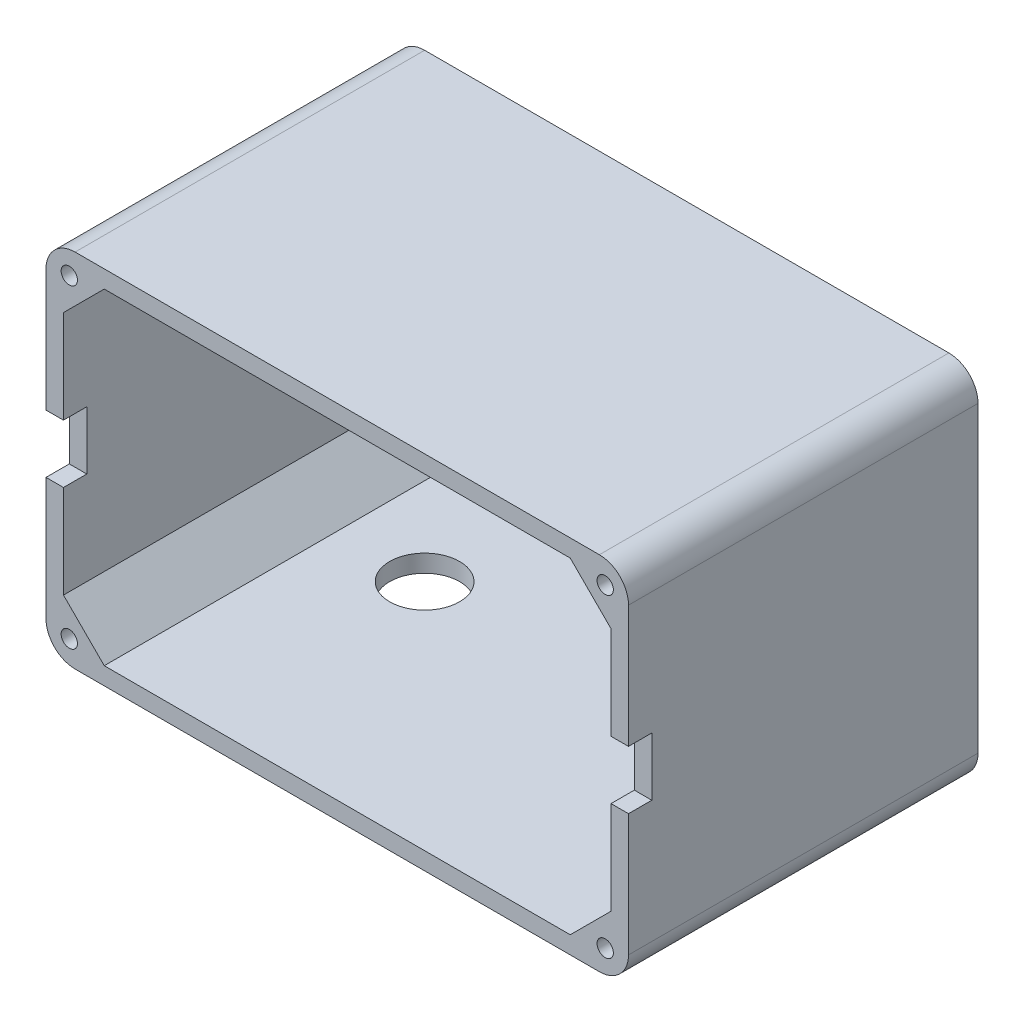
ISO-10303-21;
HEADER;
FILE_DESCRIPTION(('STEP AP214'),'2;1');
FILE_NAME('part.step','',(''),(''),'','','');
FILE_SCHEMA(('AUTOMOTIVE_DESIGN { 1 0 10303 214 1 1 1 1 }'));
ENDSEC;
DATA;
#1=APPLICATION_CONTEXT('core data for automotive mechanical design processes');
#2=APPLICATION_PROTOCOL_DEFINITION('international standard','automotive_design',2000,#1);
#3=PRODUCT_CONTEXT('',#1,'mechanical');
#4=PRODUCT('Part','Part','',(#3));
#5=PRODUCT_RELATED_PRODUCT_CATEGORY('part','',(#4));
#6=PRODUCT_DEFINITION_FORMATION('','',#4);
#7=PRODUCT_DEFINITION_CONTEXT('part definition',#1,'design');
#8=PRODUCT_DEFINITION('design','',#6,#7);
#9=PRODUCT_DEFINITION_SHAPE('','',#8);
#10=(LENGTH_UNIT() NAMED_UNIT(*) SI_UNIT(.MILLI.,.METRE.));
#11=(NAMED_UNIT(*) PLANE_ANGLE_UNIT() SI_UNIT($,.RADIAN.));
#12=(NAMED_UNIT(*) SI_UNIT($,.STERADIAN.) SOLID_ANGLE_UNIT());
#13=UNCERTAINTY_MEASURE_WITH_UNIT(LENGTH_MEASURE(1.E-05),#10,'distance_accuracy_value','');
#14=(GEOMETRIC_REPRESENTATION_CONTEXT(3) GLOBAL_UNCERTAINTY_ASSIGNED_CONTEXT((#13)) GLOBAL_UNIT_ASSIGNED_CONTEXT((#10,
#11,#12)) REPRESENTATION_CONTEXT('',''));
#15=CARTESIAN_POINT('',(0.,0.,0.));
#16=DIRECTION('',(0.,0.,1.));
#17=DIRECTION('',(1.,0.,0.));
#18=AXIS2_PLACEMENT_3D('',#15,#16,#17);
#19=CARTESIAN_POINT('',(-45.,26.,60.));
#20=DIRECTION('',(0.,0.,-1.));
#21=DIRECTION('',(-1.,0.,0.));
#22=AXIS2_PLACEMENT_3D('',#19,#20,#21);
#23=PLANE('',#22);
#24=CARTESIAN_POINT('',(46.,27.,60.));
#25=DIRECTION('',(0.,0.,-1.));
#26=DIRECTION('',(-1.,0.,0.));
#27=AXIS2_PLACEMENT_3D('',#24,#25,#26);
#28=CIRCLE('',#27,1.4);
#29=CARTESIAN_POINT('',(44.6,27.,60.));
#30=VERTEX_POINT('',#29);
#31=EDGE_CURVE('E385',#30,#30,#28,.T.);
#32=ORIENTED_EDGE('',*,*,#31,.T.);
#33=EDGE_LOOP('',(#32));
#34=FACE_BOUND('',#33,.T.);
#35=CARTESIAN_POINT('',(-46.,27.,60.));
#36=DIRECTION('',(0.,0.,1.));
#37=DIRECTION('',(1.,0.,0.));
#38=AXIS2_PLACEMENT_3D('',#35,#36,#37);
#39=CIRCLE('',#38,1.4);
#40=CARTESIAN_POINT('',(-44.6,27.,60.));
#41=VERTEX_POINT('',#40);
#42=EDGE_CURVE('E402',#41,#41,#39,.T.);
#43=ORIENTED_EDGE('',*,*,#42,.F.);
#44=EDGE_LOOP('',(#43));
#45=FACE_BOUND('',#44,.T.);
#46=DIRECTION('',(0.,-1.,0.));
#47=VECTOR('',#46,1.);
#48=CARTESIAN_POINT('',(-50.,26.,60.));
#49=LINE('',#48,#47);
#50=CARTESIAN_POINT('',(-50.,26.,60.));
#51=VERTEX_POINT('',#50);
#52=CARTESIAN_POINT('',(-50.,4.99999999999999,60.));
#53=VERTEX_POINT('',#52);
#54=EDGE_CURVE('E225',#51,#53,#49,.T.);
#55=ORIENTED_EDGE('',*,*,#54,.T.);
#56=DIRECTION('',(1.,0.,0.));
#57=VECTOR('',#56,1.);
#58=CARTESIAN_POINT('',(-50.,4.99999999999999,60.));
#59=LINE('',#58,#57);
#60=CARTESIAN_POINT('',(-47.,4.99999999999999,60.));
#61=VERTEX_POINT('',#60);
#62=EDGE_CURVE('E318',#53,#61,#59,.T.);
#63=ORIENTED_EDGE('',*,*,#62,.T.);
#64=DIRECTION('',(0.,-1.,0.));
#65=VECTOR('',#64,1.);
#66=CARTESIAN_POINT('',(-47.,23.,60.));
#67=LINE('',#66,#65);
#68=CARTESIAN_POINT('',(-47.,21.,60.));
#69=VERTEX_POINT('',#68);
#70=EDGE_CURVE('E422',#69,#61,#67,.T.);
#71=ORIENTED_EDGE('',*,*,#70,.F.);
#72=DIRECTION('',(0.707106781186547,0.707106781186547,0.));
#73=VECTOR('',#72,1.);
#74=CARTESIAN_POINT('',(-47.,21.,60.));
#75=LINE('',#74,#73);
#76=CARTESIAN_POINT('',(-40.,28.,60.));
#77=VERTEX_POINT('',#76);
#78=EDGE_CURVE('E408',#69,#77,#75,.T.);
#79=ORIENTED_EDGE('',*,*,#78,.T.);
#80=DIRECTION('',(-1.,0.,0.));
#81=VECTOR('',#80,1.);
#82=CARTESIAN_POINT('',(-42.,28.,60.));
#83=LINE('',#82,#81);
#84=CARTESIAN_POINT('',(40.,28.,60.));
#85=VERTEX_POINT('',#84);
#86=EDGE_CURVE('E252',#85,#77,#83,.T.);
#87=ORIENTED_EDGE('',*,*,#86,.F.);
#88=DIRECTION('',(-0.707106781186547,0.707106781186547,0.));
#89=VECTOR('',#88,1.);
#90=CARTESIAN_POINT('',(47.,21.,60.));
#91=LINE('',#90,#89);
#92=CARTESIAN_POINT('',(47.,21.,60.));
#93=VERTEX_POINT('',#92);
#94=EDGE_CURVE('E390',#93,#85,#91,.T.);
#95=ORIENTED_EDGE('',*,*,#94,.F.);
#96=DIRECTION('',(0.,1.,0.));
#97=VECTOR('',#96,1.);
#98=CARTESIAN_POINT('',(47.,23.,60.));
#99=LINE('',#98,#97);
#100=CARTESIAN_POINT('',(47.,5.,60.));
#101=VERTEX_POINT('',#100);
#102=EDGE_CURVE('E427',#101,#93,#99,.T.);
#103=ORIENTED_EDGE('',*,*,#102,.F.);
#104=CARTESIAN_POINT('',(50.,5.,60.));
#105=VERTEX_POINT('',#104);
#106=EDGE_CURVE('E322',#101,#105,#59,.T.);
#107=ORIENTED_EDGE('',*,*,#106,.T.);
#108=DIRECTION('',(0.,1.,0.));
#109=VECTOR('',#108,1.);
#110=CARTESIAN_POINT('',(50.,26.,60.));
#111=LINE('',#110,#109);
#112=CARTESIAN_POINT('',(50.,26.,60.));
#113=VERTEX_POINT('',#112);
#114=EDGE_CURVE('E240',#105,#113,#111,.T.);
#115=ORIENTED_EDGE('',*,*,#114,.T.);
#116=CARTESIAN_POINT('',(45.,26.,60.));
#117=DIRECTION('',(0.,0.,1.));
#118=DIRECTION('',(1.,0.,0.));
#119=AXIS2_PLACEMENT_3D('',#116,#117,#118);
#120=CIRCLE('',#119,5.);
#121=CARTESIAN_POINT('',(45.,31.,60.));
#122=VERTEX_POINT('',#121);
#123=EDGE_CURVE('E243',#113,#122,#120,.T.);
#124=ORIENTED_EDGE('',*,*,#123,.T.);
#125=DIRECTION('',(-1.,0.,0.));
#126=VECTOR('',#125,1.);
#127=CARTESIAN_POINT('',(-45.,31.,60.));
#128=LINE('',#127,#126);
#129=CARTESIAN_POINT('',(-45.,31.,60.));
#130=VERTEX_POINT('',#129);
#131=EDGE_CURVE('E245',#122,#130,#128,.T.);
#132=ORIENTED_EDGE('',*,*,#131,.T.);
#133=CARTESIAN_POINT('',(-45.,26.,60.));
#134=DIRECTION('',(0.,0.,1.));
#135=DIRECTION('',(-1.,0.,0.));
#136=AXIS2_PLACEMENT_3D('',#133,#134,#135);
#137=CIRCLE('',#136,5.);
#138=EDGE_CURVE('E226',#130,#51,#137,.T.);
#139=ORIENTED_EDGE('',*,*,#138,.T.);
#140=EDGE_LOOP('',(#55,#63,#71,#79,#87,#95,#103,#107,#115,#124,#132,#139));
#141=FACE_BOUND('',#140,.T.);
#142=ADVANCED_FACE('F39',(#34,#45,#141),#23,.F.);
#143=CARTESIAN_POINT('',(-47.,23.,60.));
#144=DIRECTION('',(1.,0.,0.));
#145=DIRECTION('',(0.,1.,0.));
#146=AXIS2_PLACEMENT_3D('',#143,#144,#145);
#147=PLANE('',#146);
#148=DIRECTION('',(0.,0.,1.));
#149=VECTOR('',#148,1.);
#150=CARTESIAN_POINT('',(-47.,4.99999999999999,60.));
#151=LINE('',#150,#149);
#152=CARTESIAN_POINT('',(-47.,4.99999999999999,56.));
#153=VERTEX_POINT('',#152);
#154=EDGE_CURVE('E337',#153,#61,#151,.T.);
#155=ORIENTED_EDGE('',*,*,#154,.F.);
#156=DIRECTION('',(0.,1.,0.));
#157=VECTOR('',#156,1.);
#158=CARTESIAN_POINT('',(-47.,23.,56.));
#159=LINE('',#158,#157);
#160=CARTESIAN_POINT('',(-47.,-5.00000000000001,56.));
#161=VERTEX_POINT('',#160);
#162=EDGE_CURVE('E333',#161,#153,#159,.T.);
#163=ORIENTED_EDGE('',*,*,#162,.F.);
#164=DIRECTION('',(0.,0.,-1.));
#165=VECTOR('',#164,1.);
#166=CARTESIAN_POINT('',(-47.,-5.00000000000002,60.));
#167=LINE('',#166,#165);
#168=CARTESIAN_POINT('',(-47.,-5.00000000000001,60.));
#169=VERTEX_POINT('',#168);
#170=EDGE_CURVE('E329',#169,#161,#167,.T.);
#171=ORIENTED_EDGE('',*,*,#170,.F.);
#172=CARTESIAN_POINT('',(-47.,-21.,60.));
#173=VERTEX_POINT('',#172);
#174=EDGE_CURVE('E219',#169,#173,#67,.T.);
#175=ORIENTED_EDGE('',*,*,#174,.T.);
#176=DIRECTION('',(0.,0.,1.));
#177=VECTOR('',#176,1.);
#178=CARTESIAN_POINT('',(-47.,-21.,0.));
#179=LINE('',#178,#177);
#180=CARTESIAN_POINT('',(-47.,-21.,0.));
#181=VERTEX_POINT('',#180);
#182=EDGE_CURVE('E364',#181,#173,#179,.T.);
#183=ORIENTED_EDGE('',*,*,#182,.F.);
#184=DIRECTION('',(0.,-1.,0.));
#185=VECTOR('',#184,1.);
#186=CARTESIAN_POINT('',(-47.,23.,0.));
#187=LINE('',#186,#185);
#188=CARTESIAN_POINT('',(-47.,21.,0.));
#189=VERTEX_POINT('',#188);
#190=EDGE_CURVE('E420',#189,#181,#187,.T.);
#191=ORIENTED_EDGE('',*,*,#190,.F.);
#192=DIRECTION('',(0.,0.,1.));
#193=VECTOR('',#192,1.);
#194=CARTESIAN_POINT('',(-47.,21.,0.));
#195=LINE('',#194,#193);
#196=EDGE_CURVE('E414',#189,#69,#195,.T.);
#197=ORIENTED_EDGE('',*,*,#196,.T.);
#198=ORIENTED_EDGE('',*,*,#70,.T.);
#199=EDGE_LOOP('',(#155,#163,#171,#175,#183,#191,#197,#198));
#200=FACE_BOUND('',#199,.T.);
#201=ADVANCED_FACE('F442',(#200),#147,.T.);
#202=CARTESIAN_POINT('',(-42.,-28.,60.));
#203=DIRECTION('',(0.,1.,0.));
#204=DIRECTION('',(0.,0.,1.));
#205=AXIS2_PLACEMENT_3D('',#202,#203,#204);
#206=PLANE('',#205);
#207=CARTESIAN_POINT('',(-25.,-28.,20.));
#208=DIRECTION('',(0.,1.,0.));
#209=DIRECTION('',(0.,0.,1.));
#210=AXIS2_PLACEMENT_3D('',#207,#208,#209);
#211=CIRCLE('',#210,6.);
#212=CARTESIAN_POINT('',(-25.,-28.,26.));
#213=VERTEX_POINT('',#212);
#214=EDGE_CURVE('E348',#213,#213,#211,.T.);
#215=ORIENTED_EDGE('',*,*,#214,.F.);
#216=EDGE_LOOP('',(#215));
#217=FACE_BOUND('',#216,.T.);
#218=CARTESIAN_POINT('',(25.,-28.,20.));
#219=DIRECTION('',(0.,1.,0.));
#220=DIRECTION('',(0.,0.,1.));
#221=AXIS2_PLACEMENT_3D('',#218,#219,#220);
#222=CIRCLE('',#221,6.);
#223=CARTESIAN_POINT('',(25.,-28.,26.));
#224=VERTEX_POINT('',#223);
#225=EDGE_CURVE('E343',#224,#224,#222,.T.);
#226=ORIENTED_EDGE('',*,*,#225,.F.);
#227=EDGE_LOOP('',(#226));
#228=FACE_BOUND('',#227,.T.);
#229=DIRECTION('',(1.,0.,0.));
#230=VECTOR('',#229,1.);
#231=CARTESIAN_POINT('',(-42.,-28.,0.));
#232=LINE('',#231,#230);
#233=CARTESIAN_POINT('',(-40.,-28.,0.));
#234=VERTEX_POINT('',#233);
#235=CARTESIAN_POINT('',(40.,-28.,0.));
#236=VERTEX_POINT('',#235);
#237=EDGE_CURVE('E433',#234,#236,#232,.T.);
#238=ORIENTED_EDGE('',*,*,#237,.F.);
#239=DIRECTION('',(0.,0.,1.));
#240=VECTOR('',#239,1.);
#241=CARTESIAN_POINT('',(-40.,-28.,0.));
#242=LINE('',#241,#240);
#243=CARTESIAN_POINT('',(-40.,-28.,60.));
#244=VERTEX_POINT('',#243);
#245=EDGE_CURVE('E361',#234,#244,#242,.T.);
#246=ORIENTED_EDGE('',*,*,#245,.T.);
#247=DIRECTION('',(1.,0.,0.));
#248=VECTOR('',#247,1.);
#249=CARTESIAN_POINT('',(-42.,-28.,60.));
#250=LINE('',#249,#248);
#251=CARTESIAN_POINT('',(40.,-28.,60.));
#252=VERTEX_POINT('',#251);
#253=EDGE_CURVE('E425',#244,#252,#250,.T.);
#254=ORIENTED_EDGE('',*,*,#253,.T.);
#255=DIRECTION('',(0.,0.,1.));
#256=VECTOR('',#255,1.);
#257=CARTESIAN_POINT('',(40.,-28.,0.));
#258=LINE('',#257,#256);
#259=EDGE_CURVE('E382',#236,#252,#258,.T.);
#260=ORIENTED_EDGE('',*,*,#259,.F.);
#261=EDGE_LOOP('',(#238,#246,#254,#260));
#262=FACE_BOUND('',#261,.T.);
#263=ADVANCED_FACE('F451',(#217,#228,#262),#206,.T.);
#264=CARTESIAN_POINT('',(47.,23.,60.));
#265=DIRECTION('',(-1.,0.,0.));
#266=DIRECTION('',(0.,0.,1.));
#267=AXIS2_PLACEMENT_3D('',#264,#265,#266);
#268=PLANE('',#267);
#269=DIRECTION('',(0.,0.,-1.));
#270=VECTOR('',#269,1.);
#271=CARTESIAN_POINT('',(47.,5.,60.));
#272=LINE('',#271,#270);
#273=CARTESIAN_POINT('',(47.,5.,56.));
#274=VERTEX_POINT('',#273);
#275=EDGE_CURVE('E335',#101,#274,#272,.T.);
#276=ORIENTED_EDGE('',*,*,#275,.F.);
#277=ORIENTED_EDGE('',*,*,#102,.T.);
#278=DIRECTION('',(0.,0.,1.));
#279=VECTOR('',#278,1.);
#280=CARTESIAN_POINT('',(47.,21.,0.));
#281=LINE('',#280,#279);
#282=CARTESIAN_POINT('',(47.,21.,0.));
#283=VERTEX_POINT('',#282);
#284=EDGE_CURVE('E399',#283,#93,#281,.T.);
#285=ORIENTED_EDGE('',*,*,#284,.F.);
#286=DIRECTION('',(0.,1.,0.));
#287=VECTOR('',#286,1.);
#288=CARTESIAN_POINT('',(47.,23.,0.));
#289=LINE('',#288,#287);
#290=CARTESIAN_POINT('',(47.,-21.,0.));
#291=VERTEX_POINT('',#290);
#292=EDGE_CURVE('E435',#291,#283,#289,.T.);
#293=ORIENTED_EDGE('',*,*,#292,.F.);
#294=DIRECTION('',(0.,0.,1.));
#295=VECTOR('',#294,1.);
#296=CARTESIAN_POINT('',(47.,-21.,0.));
#297=LINE('',#296,#295);
#298=CARTESIAN_POINT('',(47.,-21.,60.));
#299=VERTEX_POINT('',#298);
#300=EDGE_CURVE('E379',#291,#299,#297,.T.);
#301=ORIENTED_EDGE('',*,*,#300,.T.);
#302=CARTESIAN_POINT('',(47.,-5.,60.));
#303=VERTEX_POINT('',#302);
#304=EDGE_CURVE('E428',#299,#303,#99,.T.);
#305=ORIENTED_EDGE('',*,*,#304,.T.);
#306=DIRECTION('',(0.,0.,1.));
#307=VECTOR('',#306,1.);
#308=CARTESIAN_POINT('',(47.,-5.,60.));
#309=LINE('',#308,#307);
#310=CARTESIAN_POINT('',(47.,-5.,56.));
#311=VERTEX_POINT('',#310);
#312=EDGE_CURVE('E321',#311,#303,#309,.T.);
#313=ORIENTED_EDGE('',*,*,#312,.F.);
#314=DIRECTION('',(0.,-1.,0.));
#315=VECTOR('',#314,1.);
#316=CARTESIAN_POINT('',(47.,23.,56.));
#317=LINE('',#316,#315);
#318=EDGE_CURVE('E331',#274,#311,#317,.T.);
#319=ORIENTED_EDGE('',*,*,#318,.F.);
#320=EDGE_LOOP('',(#276,#277,#285,#293,#301,#305,#313,#319));
#321=FACE_BOUND('',#320,.T.);
#322=ADVANCED_FACE('F497',(#321),#268,.T.);
#323=CARTESIAN_POINT('',(-42.,28.,60.));
#324=DIRECTION('',(0.,-1.,0.));
#325=DIRECTION('',(0.,0.,-1.));
#326=AXIS2_PLACEMENT_3D('',#323,#324,#325);
#327=PLANE('',#326);
#328=DIRECTION('',(-1.,0.,0.));
#329=VECTOR('',#328,1.);
#330=CARTESIAN_POINT('',(-42.,28.,0.));
#331=LINE('',#330,#329);
#332=CARTESIAN_POINT('',(40.,28.,0.));
#333=VERTEX_POINT('',#332);
#334=CARTESIAN_POINT('',(-40.,28.,0.));
#335=VERTEX_POINT('',#334);
#336=EDGE_CURVE('E436',#333,#335,#331,.T.);
#337=ORIENTED_EDGE('',*,*,#336,.F.);
#338=DIRECTION('',(0.,0.,1.));
#339=VECTOR('',#338,1.);
#340=CARTESIAN_POINT('',(40.,28.,0.));
#341=LINE('',#340,#339);
#342=EDGE_CURVE('E396',#333,#85,#341,.T.);
#343=ORIENTED_EDGE('',*,*,#342,.T.);
#344=ORIENTED_EDGE('',*,*,#86,.T.);
#345=DIRECTION('',(0.,0.,1.));
#346=VECTOR('',#345,1.);
#347=CARTESIAN_POINT('',(-40.,28.,0.));
#348=LINE('',#347,#346);
#349=EDGE_CURVE('E417',#335,#77,#348,.T.);
#350=ORIENTED_EDGE('',*,*,#349,.F.);
#351=EDGE_LOOP('',(#337,#343,#344,#350));
#352=FACE_BOUND('',#351,.T.);
#353=ADVANCED_FACE('F490',(#352),#327,.T.);
#354=CARTESIAN_POINT('',(-46.,-27.,60.));
#355=DIRECTION('',(0.,0.,-1.));
#356=DIRECTION('',(1.,0.,0.));
#357=AXIS2_PLACEMENT_3D('',#354,#355,#356);
#358=CIRCLE('',#357,1.4);
#359=CARTESIAN_POINT('',(-44.6,-27.,60.));
#360=VERTEX_POINT('',#359);
#361=EDGE_CURVE('E351',#360,#360,#358,.T.);
#362=ORIENTED_EDGE('',*,*,#361,.T.);
#363=EDGE_LOOP('',(#362));
#364=FACE_BOUND('',#363,.T.);
#365=CARTESIAN_POINT('',(50.,-26.,60.));
#366=VERTEX_POINT('',#365);
#367=CARTESIAN_POINT('',(50.,-5.,60.));
#368=VERTEX_POINT('',#367);
#369=EDGE_CURVE('E241',#366,#368,#111,.T.);
#370=ORIENTED_EDGE('',*,*,#369,.T.);
#371=DIRECTION('',(1.,0.,0.));
#372=VECTOR('',#371,1.);
#373=CARTESIAN_POINT('',(-50.,-5.00000000000001,60.));
#374=LINE('',#373,#372);
#375=EDGE_CURVE('E62',#303,#368,#374,.T.);
#376=ORIENTED_EDGE('',*,*,#375,.F.);
#377=ORIENTED_EDGE('',*,*,#304,.F.);
#378=DIRECTION('',(-0.707106781186547,-0.707106781186547,0.));
#379=VECTOR('',#378,1.);
#380=CARTESIAN_POINT('',(47.,-21.,60.));
#381=LINE('',#380,#379);
#382=EDGE_CURVE('E373',#299,#252,#381,.T.);
#383=ORIENTED_EDGE('',*,*,#382,.T.);
#384=ORIENTED_EDGE('',*,*,#253,.F.);
#385=DIRECTION('',(0.707106781186547,-0.707106781186547,0.));
#386=VECTOR('',#385,1.);
#387=CARTESIAN_POINT('',(-47.,-21.,60.));
#388=LINE('',#387,#386);
#389=EDGE_CURVE('E355',#173,#244,#388,.T.);
#390=ORIENTED_EDGE('',*,*,#389,.F.);
#391=ORIENTED_EDGE('',*,*,#174,.F.);
#392=CARTESIAN_POINT('',(-50.,-5.00000000000001,60.));
#393=VERTEX_POINT('',#392);
#394=EDGE_CURVE('E204',#393,#169,#374,.T.);
#395=ORIENTED_EDGE('',*,*,#394,.F.);
#396=CARTESIAN_POINT('',(-50.,-26.,60.));
#397=VERTEX_POINT('',#396);
#398=EDGE_CURVE('E216',#393,#397,#49,.T.);
#399=ORIENTED_EDGE('',*,*,#398,.T.);
#400=CARTESIAN_POINT('',(-45.,-26.,60.));
#401=DIRECTION('',(0.,0.,1.));
#402=DIRECTION('',(-1.,0.,0.));
#403=AXIS2_PLACEMENT_3D('',#400,#401,#402);
#404=CIRCLE('',#403,5.);
#405=CARTESIAN_POINT('',(-45.,-31.,60.));
#406=VERTEX_POINT('',#405);
#407=EDGE_CURVE('E229',#397,#406,#404,.T.);
#408=ORIENTED_EDGE('',*,*,#407,.T.);
#409=DIRECTION('',(1.,0.,0.));
#410=VECTOR('',#409,1.);
#411=CARTESIAN_POINT('',(-45.,-31.,60.));
#412=LINE('',#411,#410);
#413=CARTESIAN_POINT('',(45.,-31.,60.));
#414=VERTEX_POINT('',#413);
#415=EDGE_CURVE('E236',#406,#414,#412,.T.);
#416=ORIENTED_EDGE('',*,*,#415,.T.);
#417=CARTESIAN_POINT('',(45.,-26.,60.));
#418=DIRECTION('',(0.,0.,1.));
#419=DIRECTION('',(1.,0.,0.));
#420=AXIS2_PLACEMENT_3D('',#417,#418,#419);
#421=CIRCLE('',#420,5.);
#422=EDGE_CURVE('E238',#414,#366,#421,.T.);
#423=ORIENTED_EDGE('',*,*,#422,.T.);
#424=EDGE_LOOP('',(#370,#376,#377,#383,#384,#390,#391,#395,#399,#408,#416,#423));
#425=FACE_BOUND('',#424,.T.);
#426=CARTESIAN_POINT('',(46.,-27.,60.));
#427=DIRECTION('',(0.,0.,1.));
#428=DIRECTION('',(-1.,0.,0.));
#429=AXIS2_PLACEMENT_3D('',#426,#427,#428);
#430=CIRCLE('',#429,1.4);
#431=CARTESIAN_POINT('',(44.6,-27.,60.));
#432=VERTEX_POINT('',#431);
#433=EDGE_CURVE('E367',#432,#432,#430,.T.);
#434=ORIENTED_EDGE('',*,*,#433,.F.);
#435=EDGE_LOOP('',(#434));
#436=FACE_BOUND('',#435,.T.);
#437=ADVANCED_FACE('F214',(#364,#425,#436),#23,.F.);
#438=CARTESIAN_POINT('',(-45.,26.,0.));
#439=DIRECTION('',(0.,0.,-1.));
#440=DIRECTION('',(-1.,0.,0.));
#441=AXIS2_PLACEMENT_3D('',#438,#439,#440);
#442=PLANE('',#441);
#443=CARTESIAN_POINT('',(-46.,-27.,0.));
#444=DIRECTION('',(0.,0.,-1.));
#445=DIRECTION('',(1.,0.,0.));
#446=AXIS2_PLACEMENT_3D('',#443,#444,#445);
#447=CIRCLE('',#446,1.4);
#448=CARTESIAN_POINT('',(-44.6,-27.,0.));
#449=VERTEX_POINT('',#448);
#450=EDGE_CURVE('E352',#449,#449,#447,.T.);
#451=ORIENTED_EDGE('',*,*,#450,.F.);
#452=EDGE_LOOP('',(#451));
#453=FACE_BOUND('',#452,.T.);
#454=ORIENTED_EDGE('',*,*,#190,.T.);
#455=DIRECTION('',(0.707106781186547,-0.707106781186547,0.));
#456=VECTOR('',#455,1.);
#457=CARTESIAN_POINT('',(-47.,-21.,0.));
#458=LINE('',#457,#456);
#459=EDGE_CURVE('E358',#181,#234,#458,.T.);
#460=ORIENTED_EDGE('',*,*,#459,.T.);
#461=ORIENTED_EDGE('',*,*,#237,.T.);
#462=DIRECTION('',(-0.707106781186547,-0.707106781186547,0.));
#463=VECTOR('',#462,1.);
#464=CARTESIAN_POINT('',(47.,-21.,0.));
#465=LINE('',#464,#463);
#466=EDGE_CURVE('E376',#291,#236,#465,.T.);
#467=ORIENTED_EDGE('',*,*,#466,.F.);
#468=ORIENTED_EDGE('',*,*,#292,.T.);
#469=DIRECTION('',(-0.707106781186547,0.707106781186547,0.));
#470=VECTOR('',#469,1.);
#471=CARTESIAN_POINT('',(47.,21.,0.));
#472=LINE('',#471,#470);
#473=EDGE_CURVE('E393',#283,#333,#472,.T.);
#474=ORIENTED_EDGE('',*,*,#473,.T.);
#475=ORIENTED_EDGE('',*,*,#336,.T.);
#476=DIRECTION('',(0.707106781186547,0.707106781186547,0.));
#477=VECTOR('',#476,1.);
#478=CARTESIAN_POINT('',(-47.,21.,0.));
#479=LINE('',#478,#477);
#480=EDGE_CURVE('E411',#189,#335,#479,.T.);
#481=ORIENTED_EDGE('',*,*,#480,.F.);
#482=EDGE_LOOP('',(#454,#460,#461,#467,#468,#474,#475,#481));
#483=FACE_BOUND('',#482,.T.);
#484=CARTESIAN_POINT('',(46.,-27.,0.));
#485=DIRECTION('',(0.,0.,1.));
#486=DIRECTION('',(-1.,0.,0.));
#487=AXIS2_PLACEMENT_3D('',#484,#485,#486);
#488=CIRCLE('',#487,1.4);
#489=CARTESIAN_POINT('',(44.6,-27.,0.));
#490=VERTEX_POINT('',#489);
#491=EDGE_CURVE('E370',#490,#490,#488,.T.);
#492=ORIENTED_EDGE('',*,*,#491,.T.);
#493=EDGE_LOOP('',(#492));
#494=FACE_BOUND('',#493,.T.);
#495=CARTESIAN_POINT('',(46.,27.,0.));
#496=DIRECTION('',(0.,0.,-1.));
#497=DIRECTION('',(-1.,0.,0.));
#498=AXIS2_PLACEMENT_3D('',#495,#496,#497);
#499=CIRCLE('',#498,1.4);
#500=CARTESIAN_POINT('',(44.6,27.,0.));
#501=VERTEX_POINT('',#500);
#502=EDGE_CURVE('E387',#501,#501,#499,.T.);
#503=ORIENTED_EDGE('',*,*,#502,.F.);
#504=EDGE_LOOP('',(#503));
#505=FACE_BOUND('',#504,.T.);
#506=CARTESIAN_POINT('',(-46.,27.,0.));
#507=DIRECTION('',(0.,0.,1.));
#508=DIRECTION('',(1.,0.,0.));
#509=AXIS2_PLACEMENT_3D('',#506,#507,#508);
#510=CIRCLE('',#509,1.4);
#511=CARTESIAN_POINT('',(-44.6,27.,0.));
#512=VERTEX_POINT('',#511);
#513=EDGE_CURVE('E405',#512,#512,#510,.T.);
#514=ORIENTED_EDGE('',*,*,#513,.T.);
#515=EDGE_LOOP('',(#514));
#516=FACE_BOUND('',#515,.T.);
#517=CARTESIAN_POINT('',(-45.,26.,0.));
#518=DIRECTION('',(0.,0.,1.));
#519=DIRECTION('',(-1.,0.,0.));
#520=AXIS2_PLACEMENT_3D('',#517,#518,#519);
#521=CIRCLE('',#520,5.);
#522=CARTESIAN_POINT('',(-45.,31.,0.));
#523=VERTEX_POINT('',#522);
#524=CARTESIAN_POINT('',(-50.,26.,0.));
#525=VERTEX_POINT('',#524);
#526=EDGE_CURVE('E248',#523,#525,#521,.T.);
#527=ORIENTED_EDGE('',*,*,#526,.F.);
#528=DIRECTION('',(-1.,0.,0.));
#529=VECTOR('',#528,1.);
#530=CARTESIAN_POINT('',(-45.,31.,0.));
#531=LINE('',#530,#529);
#532=CARTESIAN_POINT('',(45.,31.,0.));
#533=VERTEX_POINT('',#532);
#534=EDGE_CURVE('E231',#533,#523,#531,.T.);
#535=ORIENTED_EDGE('',*,*,#534,.F.);
#536=CARTESIAN_POINT('',(45.,26.,0.));
#537=DIRECTION('',(0.,0.,1.));
#538=DIRECTION('',(1.,0.,0.));
#539=AXIS2_PLACEMENT_3D('',#536,#537,#538);
#540=CIRCLE('',#539,5.);
#541=CARTESIAN_POINT('',(50.,26.,0.));
#542=VERTEX_POINT('',#541);
#543=EDGE_CURVE('E262',#542,#533,#540,.T.);
#544=ORIENTED_EDGE('',*,*,#543,.F.);
#545=DIRECTION('',(0.,1.,0.));
#546=VECTOR('',#545,1.);
#547=CARTESIAN_POINT('',(50.,26.,0.));
#548=LINE('',#547,#546);
#549=CARTESIAN_POINT('',(50.,-26.,0.));
#550=VERTEX_POINT('',#549);
#551=EDGE_CURVE('E260',#550,#542,#548,.T.);
#552=ORIENTED_EDGE('',*,*,#551,.F.);
#553=CARTESIAN_POINT('',(45.,-26.,0.));
#554=DIRECTION('',(0.,0.,1.));
#555=DIRECTION('',(1.,0.,0.));
#556=AXIS2_PLACEMENT_3D('',#553,#554,#555);
#557=CIRCLE('',#556,5.);
#558=CARTESIAN_POINT('',(45.,-31.,0.));
#559=VERTEX_POINT('',#558);
#560=EDGE_CURVE('E258',#559,#550,#557,.T.);
#561=ORIENTED_EDGE('',*,*,#560,.F.);
#562=DIRECTION('',(1.,0.,0.));
#563=VECTOR('',#562,1.);
#564=CARTESIAN_POINT('',(-45.,-31.,0.));
#565=LINE('',#564,#563);
#566=CARTESIAN_POINT('',(-45.,-31.,0.));
#567=VERTEX_POINT('',#566);
#568=EDGE_CURVE('E256',#567,#559,#565,.T.);
#569=ORIENTED_EDGE('',*,*,#568,.F.);
#570=CARTESIAN_POINT('',(-45.,-26.,0.));
#571=DIRECTION('',(0.,0.,1.));
#572=DIRECTION('',(-1.,0.,0.));
#573=AXIS2_PLACEMENT_3D('',#570,#571,#572);
#574=CIRCLE('',#573,5.);
#575=CARTESIAN_POINT('',(-50.,-26.,0.));
#576=VERTEX_POINT('',#575);
#577=EDGE_CURVE('E254',#576,#567,#574,.T.);
#578=ORIENTED_EDGE('',*,*,#577,.F.);
#579=DIRECTION('',(0.,-1.,0.));
#580=VECTOR('',#579,1.);
#581=CARTESIAN_POINT('',(-50.,26.,0.));
#582=LINE('',#581,#580);
#583=EDGE_CURVE('E251',#525,#576,#582,.T.);
#584=ORIENTED_EDGE('',*,*,#583,.F.);
#585=EDGE_LOOP('',(#527,#535,#544,#552,#561,#569,#578,#584));
#586=FACE_BOUND('',#585,.T.);
#587=ADVANCED_FACE('F288',(#453,#483,#494,#505,#516,#586),#442,.T.);
#588=CARTESIAN_POINT('',(-45.,26.,60.));
#589=DIRECTION('',(0.,0.,-1.));
#590=DIRECTION('',(-1.,0.,0.));
#591=AXIS2_PLACEMENT_3D('',#588,#589,#590);
#592=CYLINDRICAL_SURFACE('',#591,5.);
#593=ORIENTED_EDGE('',*,*,#526,.T.);
#594=DIRECTION('',(0.,0.,-1.));
#595=VECTOR('',#594,1.);
#596=CARTESIAN_POINT('',(-50.,26.,60.));
#597=LINE('',#596,#595);
#598=EDGE_CURVE('E11',#51,#525,#597,.T.);
#599=ORIENTED_EDGE('',*,*,#598,.F.);
#600=ORIENTED_EDGE('',*,*,#138,.F.);
#601=DIRECTION('',(0.,0.,-1.));
#602=VECTOR('',#601,1.);
#603=CARTESIAN_POINT('',(-45.,31.,60.));
#604=LINE('',#603,#602);
#605=EDGE_CURVE('E247',#130,#523,#604,.T.);
#606=ORIENTED_EDGE('',*,*,#605,.T.);
#607=EDGE_LOOP('',(#593,#599,#600,#606));
#608=FACE_BOUND('',#607,.T.);
#609=ADVANCED_FACE('F41',(#608),#592,.T.);
#610=CARTESIAN_POINT('',(-50.,26.,60.));
#611=DIRECTION('',(1.,0.,0.));
#612=DIRECTION('',(0.,1.,0.));
#613=AXIS2_PLACEMENT_3D('',#610,#611,#612);
#614=PLANE('',#613);
#615=DIRECTION('',(0.,1.,0.));
#616=VECTOR('',#615,1.);
#617=CARTESIAN_POINT('',(-50.,4.99999999999999,56.));
#618=LINE('',#617,#616);
#619=CARTESIAN_POINT('',(-50.,-5.00000000000002,56.));
#620=VERTEX_POINT('',#619);
#621=CARTESIAN_POINT('',(-50.,4.99999999999999,56.));
#622=VERTEX_POINT('',#621);
#623=EDGE_CURVE('E54',#620,#622,#618,.T.);
#624=ORIENTED_EDGE('',*,*,#623,.T.);
#625=DIRECTION('',(0.,0.,1.));
#626=VECTOR('',#625,1.);
#627=CARTESIAN_POINT('',(-50.,4.99999999999999,60.));
#628=LINE('',#627,#626);
#629=EDGE_CURVE('E314',#622,#53,#628,.T.);
#630=ORIENTED_EDGE('',*,*,#629,.T.);
#631=ORIENTED_EDGE('',*,*,#54,.F.);
#632=ORIENTED_EDGE('',*,*,#598,.T.);
#633=ORIENTED_EDGE('',*,*,#583,.T.);
#634=DIRECTION('',(0.,0.,-1.));
#635=VECTOR('',#634,1.);
#636=CARTESIAN_POINT('',(-50.,-26.,60.));
#637=LINE('',#636,#635);
#638=EDGE_CURVE('E47',#397,#576,#637,.T.);
#639=ORIENTED_EDGE('',*,*,#638,.F.);
#640=ORIENTED_EDGE('',*,*,#398,.F.);
#641=DIRECTION('',(0.,0.,-1.));
#642=VECTOR('',#641,1.);
#643=CARTESIAN_POINT('',(-50.,-5.00000000000001,60.));
#644=LINE('',#643,#642);
#645=EDGE_CURVE('E201',#393,#620,#644,.T.);
#646=ORIENTED_EDGE('',*,*,#645,.T.);
#647=EDGE_LOOP('',(#624,#630,#631,#632,#633,#639,#640,#646));
#648=FACE_BOUND('',#647,.T.);
#649=ADVANCED_FACE('F222',(#648),#614,.F.);
#650=CARTESIAN_POINT('',(-45.,-26.,60.));
#651=DIRECTION('',(0.,0.,-1.));
#652=DIRECTION('',(-1.,0.,0.));
#653=AXIS2_PLACEMENT_3D('',#650,#651,#652);
#654=CYLINDRICAL_SURFACE('',#653,5.);
#655=ORIENTED_EDGE('',*,*,#577,.T.);
#656=DIRECTION('',(0.,0.,-1.));
#657=VECTOR('',#656,1.);
#658=CARTESIAN_POINT('',(-45.,-31.,60.));
#659=LINE('',#658,#657);
#660=EDGE_CURVE('E279',#406,#567,#659,.T.);
#661=ORIENTED_EDGE('',*,*,#660,.F.);
#662=ORIENTED_EDGE('',*,*,#407,.F.);
#663=ORIENTED_EDGE('',*,*,#638,.T.);
#664=EDGE_LOOP('',(#655,#661,#662,#663));
#665=FACE_BOUND('',#664,.T.);
#666=ADVANCED_FACE('F283',(#665),#654,.T.);
#667=CARTESIAN_POINT('',(-45.,-31.,60.));
#668=DIRECTION('',(0.,1.,0.));
#669=DIRECTION('',(0.,0.,1.));
#670=AXIS2_PLACEMENT_3D('',#667,#668,#669);
#671=PLANE('',#670);
#672=CARTESIAN_POINT('',(-25.,-31.,20.));
#673=DIRECTION('',(0.,-1.,0.));
#674=DIRECTION('',(0.,0.,-1.));
#675=AXIS2_PLACEMENT_3D('',#672,#673,#674);
#676=CIRCLE('',#675,6.);
#677=CARTESIAN_POINT('',(-25.,-31.,14.));
#678=VERTEX_POINT('',#677);
#679=EDGE_CURVE('E340',#678,#678,#676,.T.);
#680=ORIENTED_EDGE('',*,*,#679,.F.);
#681=EDGE_LOOP('',(#680));
#682=FACE_BOUND('',#681,.T.);
#683=CARTESIAN_POINT('',(25.,-31.,20.));
#684=DIRECTION('',(0.,-1.,0.));
#685=DIRECTION('',(0.,0.,-1.));
#686=AXIS2_PLACEMENT_3D('',#683,#684,#685);
#687=CIRCLE('',#686,6.);
#688=CARTESIAN_POINT('',(25.,-31.,14.));
#689=VERTEX_POINT('',#688);
#690=EDGE_CURVE('E339',#689,#689,#687,.T.);
#691=ORIENTED_EDGE('',*,*,#690,.F.);
#692=EDGE_LOOP('',(#691));
#693=FACE_BOUND('',#692,.T.);
#694=ORIENTED_EDGE('',*,*,#568,.T.);
#695=DIRECTION('',(0.,0.,-1.));
#696=VECTOR('',#695,1.);
#697=CARTESIAN_POINT('',(45.,-31.,60.));
#698=LINE('',#697,#696);
#699=EDGE_CURVE('E276',#414,#559,#698,.T.);
#700=ORIENTED_EDGE('',*,*,#699,.F.);
#701=ORIENTED_EDGE('',*,*,#415,.F.);
#702=ORIENTED_EDGE('',*,*,#660,.T.);
#703=EDGE_LOOP('',(#694,#700,#701,#702));
#704=FACE_BOUND('',#703,.T.);
#705=ADVANCED_FACE('F293',(#682,#693,#704),#671,.F.);
#706=CARTESIAN_POINT('',(45.,-26.,60.));
#707=DIRECTION('',(0.,0.,-1.));
#708=DIRECTION('',(-1.,0.,0.));
#709=AXIS2_PLACEMENT_3D('',#706,#707,#708);
#710=CYLINDRICAL_SURFACE('',#709,5.);
#711=ORIENTED_EDGE('',*,*,#560,.T.);
#712=DIRECTION('',(0.,0.,-1.));
#713=VECTOR('',#712,1.);
#714=CARTESIAN_POINT('',(50.,-26.,60.));
#715=LINE('',#714,#713);
#716=EDGE_CURVE('E273',#366,#550,#715,.T.);
#717=ORIENTED_EDGE('',*,*,#716,.F.);
#718=ORIENTED_EDGE('',*,*,#422,.F.);
#719=ORIENTED_EDGE('',*,*,#699,.T.);
#720=EDGE_LOOP('',(#711,#717,#718,#719));
#721=FACE_BOUND('',#720,.T.);
#722=ADVANCED_FACE('F297',(#721),#710,.T.);
#723=CARTESIAN_POINT('',(50.,26.,60.));
#724=DIRECTION('',(-1.,0.,0.));
#725=DIRECTION('',(0.,-1.,0.));
#726=AXIS2_PLACEMENT_3D('',#723,#724,#725);
#727=PLANE('',#726);
#728=ORIENTED_EDGE('',*,*,#114,.F.);
#729=DIRECTION('',(0.,0.,1.));
#730=VECTOR('',#729,1.);
#731=CARTESIAN_POINT('',(50.,5.,60.));
#732=LINE('',#731,#730);
#733=CARTESIAN_POINT('',(50.,5.,56.));
#734=VERTEX_POINT('',#733);
#735=EDGE_CURVE('E209',#734,#105,#732,.T.);
#736=ORIENTED_EDGE('',*,*,#735,.F.);
#737=DIRECTION('',(0.,1.,0.));
#738=VECTOR('',#737,1.);
#739=CARTESIAN_POINT('',(50.,5.,56.));
#740=LINE('',#739,#738);
#741=CARTESIAN_POINT('',(50.,-5.,56.));
#742=VERTEX_POINT('',#741);
#743=EDGE_CURVE('E309',#742,#734,#740,.T.);
#744=ORIENTED_EDGE('',*,*,#743,.F.);
#745=DIRECTION('',(0.,0.,-1.));
#746=VECTOR('',#745,1.);
#747=CARTESIAN_POINT('',(50.,-5.,60.));
#748=LINE('',#747,#746);
#749=EDGE_CURVE('E306',#368,#742,#748,.T.);
#750=ORIENTED_EDGE('',*,*,#749,.F.);
#751=ORIENTED_EDGE('',*,*,#369,.F.);
#752=ORIENTED_EDGE('',*,*,#716,.T.);
#753=ORIENTED_EDGE('',*,*,#551,.T.);
#754=DIRECTION('',(0.,0.,-1.));
#755=VECTOR('',#754,1.);
#756=CARTESIAN_POINT('',(50.,26.,60.));
#757=LINE('',#756,#755);
#758=EDGE_CURVE('E270',#113,#542,#757,.T.);
#759=ORIENTED_EDGE('',*,*,#758,.F.);
#760=EDGE_LOOP('',(#728,#736,#744,#750,#751,#752,#753,#759));
#761=FACE_BOUND('',#760,.T.);
#762=ADVANCED_FACE('F304',(#761),#727,.F.);
#763=CARTESIAN_POINT('',(45.,26.,60.));
#764=DIRECTION('',(0.,0.,-1.));
#765=DIRECTION('',(-1.,0.,0.));
#766=AXIS2_PLACEMENT_3D('',#763,#764,#765);
#767=CYLINDRICAL_SURFACE('',#766,5.);
#768=ORIENTED_EDGE('',*,*,#543,.T.);
#769=DIRECTION('',(0.,0.,-1.));
#770=VECTOR('',#769,1.);
#771=CARTESIAN_POINT('',(45.,31.,60.));
#772=LINE('',#771,#770);
#773=EDGE_CURVE('E267',#122,#533,#772,.T.);
#774=ORIENTED_EDGE('',*,*,#773,.F.);
#775=ORIENTED_EDGE('',*,*,#123,.F.);
#776=ORIENTED_EDGE('',*,*,#758,.T.);
#777=EDGE_LOOP('',(#768,#774,#775,#776));
#778=FACE_BOUND('',#777,.T.);
#779=ADVANCED_FACE('F583',(#778),#767,.T.);
#780=CARTESIAN_POINT('',(-45.,31.,60.));
#781=DIRECTION('',(0.,-1.,0.));
#782=DIRECTION('',(0.,0.,-1.));
#783=AXIS2_PLACEMENT_3D('',#780,#781,#782);
#784=PLANE('',#783);
#785=ORIENTED_EDGE('',*,*,#534,.T.);
#786=ORIENTED_EDGE('',*,*,#605,.F.);
#787=ORIENTED_EDGE('',*,*,#131,.F.);
#788=ORIENTED_EDGE('',*,*,#773,.T.);
#789=EDGE_LOOP('',(#785,#786,#787,#788));
#790=FACE_BOUND('',#789,.T.);
#791=ADVANCED_FACE('F538',(#790),#784,.F.);
#792=CARTESIAN_POINT('',(-47.,21.,0.));
#793=DIRECTION('',(0.707106781186547,-0.707106781186547,0.));
#794=DIRECTION('',(0.707106781186548,0.707106781186548,0.));
#795=AXIS2_PLACEMENT_3D('',#792,#793,#794);
#796=PLANE('',#795);
#797=ORIENTED_EDGE('',*,*,#78,.F.);
#798=ORIENTED_EDGE('',*,*,#196,.F.);
#799=ORIENTED_EDGE('',*,*,#480,.T.);
#800=ORIENTED_EDGE('',*,*,#349,.T.);
#801=EDGE_LOOP('',(#797,#798,#799,#800));
#802=FACE_BOUND('',#801,.T.);
#803=ADVANCED_FACE('F458',(#802),#796,.T.);
#804=CARTESIAN_POINT('',(-46.,27.,0.));
#805=DIRECTION('',(0.,0.,1.));
#806=DIRECTION('',(1.,0.,0.));
#807=AXIS2_PLACEMENT_3D('',#804,#805,#806);
#808=CYLINDRICAL_SURFACE('',#807,1.4);
#809=ORIENTED_EDGE('',*,*,#513,.F.);
#810=EDGE_LOOP('',(#809));
#811=FACE_BOUND('',#810,.T.);
#812=ORIENTED_EDGE('',*,*,#42,.T.);
#813=EDGE_LOOP('',(#812));
#814=FACE_BOUND('',#813,.T.);
#815=ADVANCED_FACE('F532',(#811,#814),#808,.F.);
#816=CARTESIAN_POINT('',(47.,21.,0.));
#817=DIRECTION('',(0.707106781186547,0.707106781186547,0.));
#818=DIRECTION('',(-0.707106781186548,0.707106781186548,0.));
#819=AXIS2_PLACEMENT_3D('',#816,#817,#818);
#820=PLANE('',#819);
#821=ORIENTED_EDGE('',*,*,#94,.T.);
#822=ORIENTED_EDGE('',*,*,#342,.F.);
#823=ORIENTED_EDGE('',*,*,#473,.F.);
#824=ORIENTED_EDGE('',*,*,#284,.T.);
#825=EDGE_LOOP('',(#821,#822,#823,#824));
#826=FACE_BOUND('',#825,.T.);
#827=ADVANCED_FACE('F528',(#826),#820,.F.);
#828=CARTESIAN_POINT('',(46.,27.,0.));
#829=DIRECTION('',(0.,0.,1.));
#830=DIRECTION('',(1.,0.,0.));
#831=AXIS2_PLACEMENT_3D('',#828,#829,#830);
#832=CYLINDRICAL_SURFACE('',#831,1.4);
#833=ORIENTED_EDGE('',*,*,#502,.T.);
#834=EDGE_LOOP('',(#833));
#835=FACE_BOUND('',#834,.T.);
#836=ORIENTED_EDGE('',*,*,#31,.F.);
#837=EDGE_LOOP('',(#836));
#838=FACE_BOUND('',#837,.T.);
#839=ADVANCED_FACE('F524',(#835,#838),#832,.F.);
#840=CARTESIAN_POINT('',(47.,-21.,0.));
#841=DIRECTION('',(-0.707106781186547,0.707106781186547,0.));
#842=DIRECTION('',(-0.707106781186548,-0.707106781186548,0.));
#843=AXIS2_PLACEMENT_3D('',#840,#841,#842);
#844=PLANE('',#843);
#845=ORIENTED_EDGE('',*,*,#382,.F.);
#846=ORIENTED_EDGE('',*,*,#300,.F.);
#847=ORIENTED_EDGE('',*,*,#466,.T.);
#848=ORIENTED_EDGE('',*,*,#259,.T.);
#849=EDGE_LOOP('',(#845,#846,#847,#848));
#850=FACE_BOUND('',#849,.T.);
#851=ADVANCED_FACE('F520',(#850),#844,.T.);
#852=CARTESIAN_POINT('',(46.,-27.,0.));
#853=DIRECTION('',(0.,0.,1.));
#854=DIRECTION('',(1.,0.,0.));
#855=AXIS2_PLACEMENT_3D('',#852,#853,#854);
#856=CYLINDRICAL_SURFACE('',#855,1.4);
#857=ORIENTED_EDGE('',*,*,#491,.F.);
#858=EDGE_LOOP('',(#857));
#859=FACE_BOUND('',#858,.T.);
#860=ORIENTED_EDGE('',*,*,#433,.T.);
#861=EDGE_LOOP('',(#860));
#862=FACE_BOUND('',#861,.T.);
#863=ADVANCED_FACE('F514',(#859,#862),#856,.F.);
#864=CARTESIAN_POINT('',(-47.,-21.,0.));
#865=DIRECTION('',(-0.707106781186547,-0.707106781186547,0.));
#866=DIRECTION('',(0.707106781186548,-0.707106781186548,0.));
#867=AXIS2_PLACEMENT_3D('',#864,#865,#866);
#868=PLANE('',#867);
#869=ORIENTED_EDGE('',*,*,#389,.T.);
#870=ORIENTED_EDGE('',*,*,#245,.F.);
#871=ORIENTED_EDGE('',*,*,#459,.F.);
#872=ORIENTED_EDGE('',*,*,#182,.T.);
#873=EDGE_LOOP('',(#869,#870,#871,#872));
#874=FACE_BOUND('',#873,.T.);
#875=ADVANCED_FACE('F446',(#874),#868,.F.);
#876=CARTESIAN_POINT('',(-46.,-27.,0.));
#877=DIRECTION('',(0.,0.,1.));
#878=DIRECTION('',(1.,0.,0.));
#879=AXIS2_PLACEMENT_3D('',#876,#877,#878);
#880=CYLINDRICAL_SURFACE('',#879,1.4);
#881=ORIENTED_EDGE('',*,*,#450,.T.);
#882=EDGE_LOOP('',(#881));
#883=FACE_BOUND('',#882,.T.);
#884=ORIENTED_EDGE('',*,*,#361,.F.);
#885=EDGE_LOOP('',(#884));
#886=FACE_BOUND('',#885,.T.);
#887=ADVANCED_FACE('F502',(#883,#886),#880,.F.);
#888=CARTESIAN_POINT('',(25.,-21.,20.));
#889=DIRECTION('',(0.,-1.,0.));
#890=DIRECTION('',(0.,0.,-1.));
#891=AXIS2_PLACEMENT_3D('',#888,#889,#890);
#892=CYLINDRICAL_SURFACE('',#891,6.);
#893=ORIENTED_EDGE('',*,*,#225,.T.);
#894=EDGE_LOOP('',(#893));
#895=FACE_BOUND('',#894,.T.);
#896=ORIENTED_EDGE('',*,*,#690,.T.);
#897=EDGE_LOOP('',(#896));
#898=FACE_BOUND('',#897,.T.);
#899=ADVANCED_FACE('F504',(#895,#898),#892,.F.);
#900=CARTESIAN_POINT('',(-25.,-21.,20.));
#901=DIRECTION('',(0.,-1.,0.));
#902=DIRECTION('',(0.,0.,-1.));
#903=AXIS2_PLACEMENT_3D('',#900,#901,#902);
#904=CYLINDRICAL_SURFACE('',#903,6.);
#905=ORIENTED_EDGE('',*,*,#214,.T.);
#906=EDGE_LOOP('',(#905));
#907=FACE_BOUND('',#906,.T.);
#908=ORIENTED_EDGE('',*,*,#679,.T.);
#909=EDGE_LOOP('',(#908));
#910=FACE_BOUND('',#909,.T.);
#911=ADVANCED_FACE('F511',(#907,#910),#904,.F.);
#912=CARTESIAN_POINT('',(-50.,-5.00000000000001,60.));
#913=DIRECTION('',(0.,-1.,0.));
#914=DIRECTION('',(1.,0.,0.));
#915=AXIS2_PLACEMENT_3D('',#912,#913,#914);
#916=PLANE('',#915);
#917=ORIENTED_EDGE('',*,*,#312,.T.);
#918=ORIENTED_EDGE('',*,*,#375,.T.);
#919=ORIENTED_EDGE('',*,*,#749,.T.);
#920=DIRECTION('',(1.,0.,0.));
#921=VECTOR('',#920,1.);
#922=CARTESIAN_POINT('',(-50.,-5.00000000000001,56.));
#923=LINE('',#922,#921);
#924=EDGE_CURVE('E220',#311,#742,#923,.T.);
#925=ORIENTED_EDGE('',*,*,#924,.F.);
#926=EDGE_LOOP('',(#917,#918,#919,#925));
#927=FACE_BOUND('',#926,.T.);
#928=ADVANCED_FACE('F474',(#927),#916,.F.);
#929=CARTESIAN_POINT('',(-50.,4.99999999999999,56.));
#930=DIRECTION('',(0.,0.,-1.));
#931=DIRECTION('',(-1.,0.,0.));
#932=AXIS2_PLACEMENT_3D('',#929,#930,#931);
#933=PLANE('',#932);
#934=ORIENTED_EDGE('',*,*,#318,.T.);
#935=ORIENTED_EDGE('',*,*,#924,.T.);
#936=ORIENTED_EDGE('',*,*,#743,.T.);
#937=DIRECTION('',(1.,0.,0.));
#938=VECTOR('',#937,1.);
#939=CARTESIAN_POINT('',(-50.,4.99999999999999,56.));
#940=LINE('',#939,#938);
#941=EDGE_CURVE('E326',#274,#734,#940,.T.);
#942=ORIENTED_EDGE('',*,*,#941,.F.);
#943=EDGE_LOOP('',(#934,#935,#936,#942));
#944=FACE_BOUND('',#943,.T.);
#945=ADVANCED_FACE('F468',(#944),#933,.F.);
#946=CARTESIAN_POINT('',(-50.,4.99999999999999,60.));
#947=DIRECTION('',(0.,1.,0.));
#948=DIRECTION('',(0.,0.,1.));
#949=AXIS2_PLACEMENT_3D('',#946,#947,#948);
#950=PLANE('',#949);
#951=ORIENTED_EDGE('',*,*,#275,.T.);
#952=ORIENTED_EDGE('',*,*,#941,.T.);
#953=ORIENTED_EDGE('',*,*,#735,.T.);
#954=ORIENTED_EDGE('',*,*,#106,.F.);
#955=EDGE_LOOP('',(#951,#952,#953,#954));
#956=FACE_BOUND('',#955,.T.);
#957=ADVANCED_FACE('F475',(#956),#950,.F.);
#958=ORIENTED_EDGE('',*,*,#154,.T.);
#959=ORIENTED_EDGE('',*,*,#62,.F.);
#960=ORIENTED_EDGE('',*,*,#629,.F.);
#961=EDGE_CURVE('E323',#622,#153,#940,.T.);
#962=ORIENTED_EDGE('',*,*,#961,.T.);
#963=EDGE_LOOP('',(#958,#959,#960,#962));
#964=FACE_BOUND('',#963,.T.);
#965=ADVANCED_FACE('F462',(#964),#950,.F.);
#966=ORIENTED_EDGE('',*,*,#162,.T.);
#967=ORIENTED_EDGE('',*,*,#961,.F.);
#968=ORIENTED_EDGE('',*,*,#623,.F.);
#969=EDGE_CURVE('E206',#620,#161,#923,.T.);
#970=ORIENTED_EDGE('',*,*,#969,.T.);
#971=EDGE_LOOP('',(#966,#967,#968,#970));
#972=FACE_BOUND('',#971,.T.);
#973=ADVANCED_FACE('F465',(#972),#933,.F.);
#974=ORIENTED_EDGE('',*,*,#170,.T.);
#975=ORIENTED_EDGE('',*,*,#969,.F.);
#976=ORIENTED_EDGE('',*,*,#645,.F.);
#977=ORIENTED_EDGE('',*,*,#394,.T.);
#978=EDGE_LOOP('',(#974,#975,#976,#977));
#979=FACE_BOUND('',#978,.T.);
#980=ADVANCED_FACE('F203',(#979),#916,.F.);
#981=CLOSED_SHELL('',(#142,#201,#263,#322,#353,#437,#587,#609,#649,#666,#705,#722,#762,#779,
#791,#803,#815,#827,#839,#851,#863,#875,#887,#899,#911,#928,#945,#957,#965,#973,#980));
#982=MANIFOLD_SOLID_BREP('B2',#981);
#983=ADVANCED_BREP_SHAPE_REPRESENTATION('',(#18,#982),#14);
#984=SHAPE_DEFINITION_REPRESENTATION(#9,#983);
ENDSEC;
END-ISO-10303-21;
